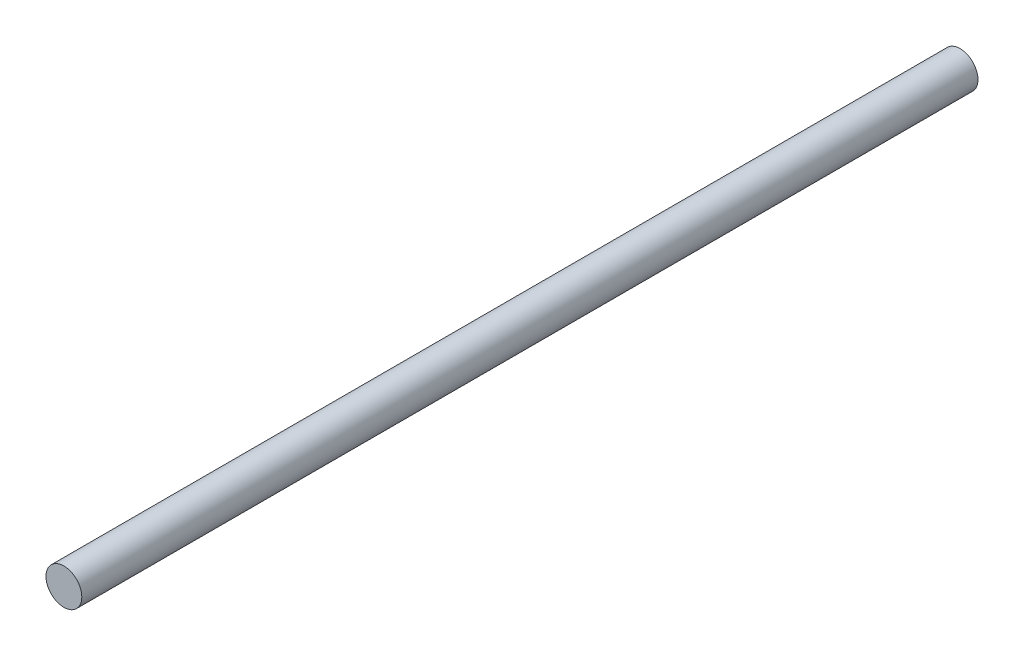
ISO-10303-21;
HEADER;
FILE_DESCRIPTION(('STEP AP214'),'2;1');
FILE_NAME('part.step','',(''),(''),'','','');
FILE_SCHEMA(('AUTOMOTIVE_DESIGN { 1 0 10303 214 1 1 1 1 }'));
ENDSEC;
DATA;
#1=APPLICATION_CONTEXT('core data for automotive mechanical design processes');
#2=APPLICATION_PROTOCOL_DEFINITION('international standard','automotive_design',2000,#1);
#3=PRODUCT_CONTEXT('',#1,'mechanical');
#4=PRODUCT('Part','Part','',(#3));
#5=PRODUCT_RELATED_PRODUCT_CATEGORY('part','',(#4));
#6=PRODUCT_DEFINITION_FORMATION('','',#4);
#7=PRODUCT_DEFINITION_CONTEXT('part definition',#1,'design');
#8=PRODUCT_DEFINITION('design','',#6,#7);
#9=PRODUCT_DEFINITION_SHAPE('','',#8);
#10=(LENGTH_UNIT() NAMED_UNIT(*) SI_UNIT(.MILLI.,.METRE.));
#11=(NAMED_UNIT(*) PLANE_ANGLE_UNIT() SI_UNIT($,.RADIAN.));
#12=(NAMED_UNIT(*) SI_UNIT($,.STERADIAN.) SOLID_ANGLE_UNIT());
#13=UNCERTAINTY_MEASURE_WITH_UNIT(LENGTH_MEASURE(1.E-05),#10,'distance_accuracy_value','');
#14=(GEOMETRIC_REPRESENTATION_CONTEXT(3) GLOBAL_UNCERTAINTY_ASSIGNED_CONTEXT((#13)) GLOBAL_UNIT_ASSIGNED_CONTEXT((#10,
#11,#12)) REPRESENTATION_CONTEXT('',''));
#15=CARTESIAN_POINT('',(0.,0.,0.));
#16=DIRECTION('',(0.,0.,1.));
#17=DIRECTION('',(1.,0.,0.));
#18=AXIS2_PLACEMENT_3D('',#15,#16,#17);
#19=CARTESIAN_POINT('',(0.,0.,400.));
#20=DIRECTION('',(0.,0.,-1.));
#21=DIRECTION('',(-1.,0.,0.));
#22=AXIS2_PLACEMENT_3D('',#19,#20,#21);
#23=CYLINDRICAL_SURFACE('',#22,8.);
#24=CARTESIAN_POINT('',(0.,0.,400.));
#25=DIRECTION('',(0.,0.,1.));
#26=DIRECTION('',(1.,0.,0.));
#27=AXIS2_PLACEMENT_3D('',#24,#25,#26);
#28=CIRCLE('',#27,8.);
#29=CARTESIAN_POINT('',(8.,0.,400.));
#30=VERTEX_POINT('',#29);
#31=EDGE_CURVE('E10',#30,#30,#28,.T.);
#32=ORIENTED_EDGE('',*,*,#31,.F.);
#33=EDGE_LOOP('',(#32));
#34=FACE_BOUND('',#33,.T.);
#35=CARTESIAN_POINT('',(0.,0.,0.));
#36=DIRECTION('',(0.,0.,1.));
#37=DIRECTION('',(1.,0.,0.));
#38=AXIS2_PLACEMENT_3D('',#35,#36,#37);
#39=CIRCLE('',#38,8.);
#40=CARTESIAN_POINT('',(8.,0.,0.));
#41=VERTEX_POINT('',#40);
#42=EDGE_CURVE('E37',#41,#41,#39,.T.);
#43=ORIENTED_EDGE('',*,*,#42,.T.);
#44=EDGE_LOOP('',(#43));
#45=FACE_BOUND('',#44,.T.);
#46=ADVANCED_FACE('F34',(#34,#45),#23,.T.);
#47=CARTESIAN_POINT('',(0.,0.,400.));
#48=DIRECTION('',(0.,0.,1.));
#49=DIRECTION('',(1.,0.,0.));
#50=AXIS2_PLACEMENT_3D('',#47,#48,#49);
#51=PLANE('',#50);
#52=ORIENTED_EDGE('',*,*,#31,.T.);
#53=EDGE_LOOP('',(#52));
#54=FACE_BOUND('',#53,.T.);
#55=ADVANCED_FACE('F49',(#54),#51,.T.);
#56=CARTESIAN_POINT('',(0.,0.,0.));
#57=DIRECTION('',(0.,0.,1.));
#58=DIRECTION('',(1.,0.,0.));
#59=AXIS2_PLACEMENT_3D('',#56,#57,#58);
#60=PLANE('',#59);
#61=ORIENTED_EDGE('',*,*,#42,.F.);
#62=EDGE_LOOP('',(#61));
#63=FACE_BOUND('',#62,.T.);
#64=ADVANCED_FACE('F47',(#63),#60,.F.);
#65=CLOSED_SHELL('',(#46,#55,#64));
#66=MANIFOLD_SOLID_BREP('B2',#65);
#67=ADVANCED_BREP_SHAPE_REPRESENTATION('',(#18,#66),#14);
#68=SHAPE_DEFINITION_REPRESENTATION(#9,#67);
ENDSEC;
END-ISO-10303-21;
